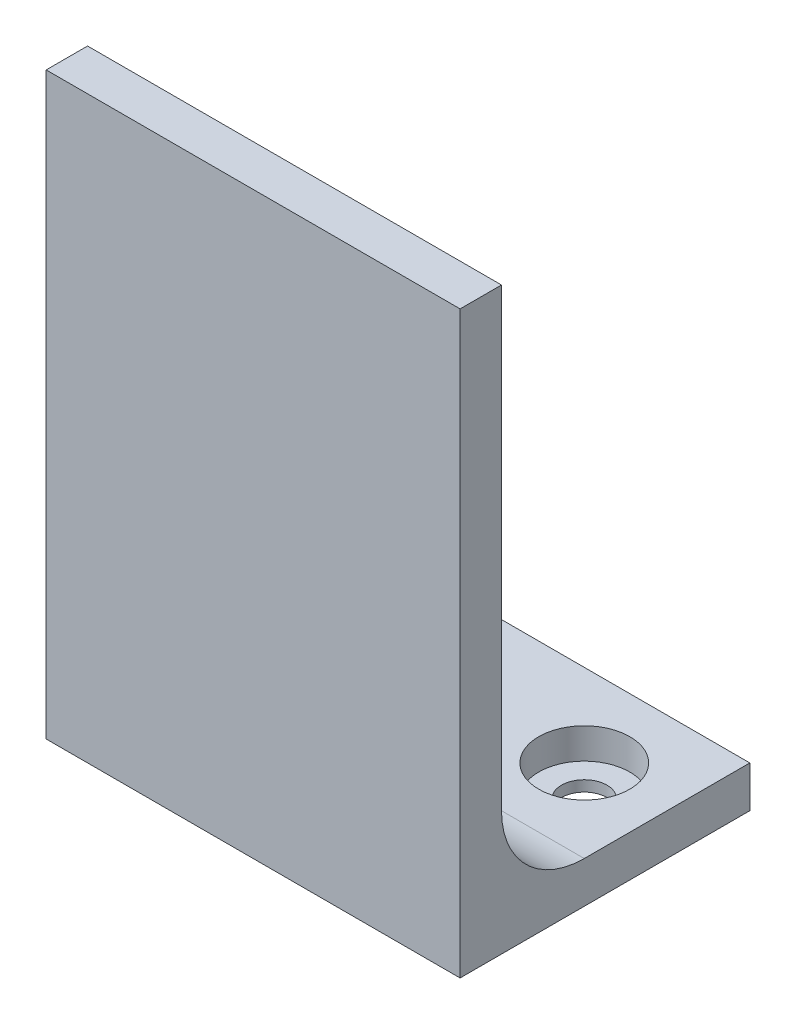
ISO-10303-21;
HEADER;
FILE_DESCRIPTION(('STEP AP214'),'2;1');
FILE_NAME('part.step','',(''),(''),'','','');
FILE_SCHEMA(('AUTOMOTIVE_DESIGN { 1 0 10303 214 1 1 1 1 }'));
ENDSEC;
DATA;
#1=APPLICATION_CONTEXT('core data for automotive mechanical design processes');
#2=APPLICATION_PROTOCOL_DEFINITION('international standard','automotive_design',2000,#1);
#3=PRODUCT_CONTEXT('',#1,'mechanical');
#4=PRODUCT('Part','Part','',(#3));
#5=PRODUCT_RELATED_PRODUCT_CATEGORY('part','',(#4));
#6=PRODUCT_DEFINITION_FORMATION('','',#4);
#7=PRODUCT_DEFINITION_CONTEXT('part definition',#1,'design');
#8=PRODUCT_DEFINITION('design','',#6,#7);
#9=PRODUCT_DEFINITION_SHAPE('','',#8);
#10=(LENGTH_UNIT() NAMED_UNIT(*) SI_UNIT(.MILLI.,.METRE.));
#11=(NAMED_UNIT(*) PLANE_ANGLE_UNIT() SI_UNIT($,.RADIAN.));
#12=(NAMED_UNIT(*) SI_UNIT($,.STERADIAN.) SOLID_ANGLE_UNIT());
#13=UNCERTAINTY_MEASURE_WITH_UNIT(LENGTH_MEASURE(1.E-05),#10,'distance_accuracy_value','');
#14=(GEOMETRIC_REPRESENTATION_CONTEXT(3) GLOBAL_UNCERTAINTY_ASSIGNED_CONTEXT((#13)) GLOBAL_UNIT_ASSIGNED_CONTEXT((#10,
#11,#12)) REPRESENTATION_CONTEXT('',''));
#15=CARTESIAN_POINT('',(0.,0.,0.));
#16=DIRECTION('',(0.,0.,1.));
#17=DIRECTION('',(1.,0.,0.));
#18=AXIS2_PLACEMENT_3D('',#15,#16,#17);
#19=CARTESIAN_POINT('',(50.,5.,-15.0000000000001));
#20=DIRECTION('',(0.,-1.,0.));
#21=DIRECTION('',(0.,0.,-1.));
#22=AXIS2_PLACEMENT_3D('',#19,#20,#21);
#23=PLANE('',#22);
#24=CARTESIAN_POINT('',(10.,5.,-25.));
#25=DIRECTION('',(0.,1.,0.));
#26=DIRECTION('',(0.,0.,1.));
#27=AXIS2_PLACEMENT_3D('',#24,#25,#26);
#28=CIRCLE('',#27,5.5);
#29=CARTESIAN_POINT('',(10.,5.,-19.5));
#30=VERTEX_POINT('',#29);
#31=EDGE_CURVE('E310',#30,#30,#28,.T.);
#32=ORIENTED_EDGE('',*,*,#31,.F.);
#33=EDGE_LOOP('',(#32));
#34=FACE_BOUND('',#33,.T.);
#35=DIRECTION('',(0.,0.,1.));
#36=VECTOR('',#35,1.);
#37=CARTESIAN_POINT('',(0.,5.,-15.0000000000001));
#38=LINE('',#37,#36);
#39=CARTESIAN_POINT('',(0.,5.,-35.));
#40=VERTEX_POINT('',#39);
#41=CARTESIAN_POINT('',(0.,5.,-15.0000000000001));
#42=VERTEX_POINT('',#41);
#43=EDGE_CURVE('E140',#40,#42,#38,.T.);
#44=ORIENTED_EDGE('',*,*,#43,.T.);
#45=DIRECTION('',(-1.,0.,0.));
#46=VECTOR('',#45,1.);
#47=CARTESIAN_POINT('',(50.,5.,-15.0000000000001));
#48=LINE('',#47,#46);
#49=CARTESIAN_POINT('',(50.,5.,-15.0000000000001));
#50=VERTEX_POINT('',#49);
#51=EDGE_CURVE('E151',#50,#42,#48,.T.);
#52=ORIENTED_EDGE('',*,*,#51,.F.);
#53=DIRECTION('',(0.,0.,1.));
#54=VECTOR('',#53,1.);
#55=CARTESIAN_POINT('',(50.,5.,-15.0000000000001));
#56=LINE('',#55,#54);
#57=CARTESIAN_POINT('',(50.,5.,-35.));
#58=VERTEX_POINT('',#57);
#59=EDGE_CURVE('E171',#58,#50,#56,.T.);
#60=ORIENTED_EDGE('',*,*,#59,.F.);
#61=DIRECTION('',(-1.,0.,0.));
#62=VECTOR('',#61,1.);
#63=CARTESIAN_POINT('',(50.,5.,-35.));
#64=LINE('',#63,#62);
#65=EDGE_CURVE('E51',#58,#40,#64,.T.);
#66=ORIENTED_EDGE('',*,*,#65,.T.);
#67=EDGE_LOOP('',(#44,#52,#60,#66));
#68=FACE_BOUND('',#67,.T.);
#69=CARTESIAN_POINT('',(40.,5.,-25.));
#70=DIRECTION('',(0.,1.,0.));
#71=DIRECTION('',(0.,0.,1.));
#72=AXIS2_PLACEMENT_3D('',#69,#70,#71);
#73=CIRCLE('',#72,5.5);
#74=CARTESIAN_POINT('',(40.,5.,-19.5));
#75=VERTEX_POINT('',#74);
#76=EDGE_CURVE('E165',#75,#75,#73,.T.);
#77=ORIENTED_EDGE('',*,*,#76,.F.);
#78=EDGE_LOOP('',(#77));
#79=FACE_BOUND('',#78,.T.);
#80=ADVANCED_FACE('F41',(#34,#68,#79),#23,.F.);
#81=CARTESIAN_POINT('',(50.,0.,-35.));
#82=DIRECTION('',(0.,1.,0.));
#83=DIRECTION('',(0.,0.,1.));
#84=AXIS2_PLACEMENT_3D('',#81,#82,#83);
#85=PLANE('',#84);
#86=CARTESIAN_POINT('',(10.,0.,-25.));
#87=DIRECTION('',(0.,1.,0.));
#88=DIRECTION('',(0.,0.,1.));
#89=AXIS2_PLACEMENT_3D('',#86,#87,#88);
#90=CIRCLE('',#89,2.74999999999999);
#91=CARTESIAN_POINT('',(10.,0.,-22.25));
#92=VERTEX_POINT('',#91);
#93=EDGE_CURVE('E45',#92,#92,#90,.T.);
#94=ORIENTED_EDGE('',*,*,#93,.T.);
#95=EDGE_LOOP('',(#94));
#96=FACE_BOUND('',#95,.T.);
#97=CARTESIAN_POINT('',(40.,0.,-25.));
#98=DIRECTION('',(0.,1.,0.));
#99=DIRECTION('',(0.,0.,1.));
#100=AXIS2_PLACEMENT_3D('',#97,#98,#99);
#101=CIRCLE('',#100,2.74999999999999);
#102=CARTESIAN_POINT('',(40.,0.,-22.25));
#103=VERTEX_POINT('',#102);
#104=EDGE_CURVE('E138',#103,#103,#101,.T.);
#105=ORIENTED_EDGE('',*,*,#104,.T.);
#106=EDGE_LOOP('',(#105));
#107=FACE_BOUND('',#106,.T.);
#108=DIRECTION('',(0.,0.,-1.));
#109=VECTOR('',#108,1.);
#110=CARTESIAN_POINT('',(0.,0.,-35.));
#111=LINE('',#110,#109);
#112=CARTESIAN_POINT('',(0.,0.,0.));
#113=VERTEX_POINT('',#112);
#114=CARTESIAN_POINT('',(0.,0.,-35.));
#115=VERTEX_POINT('',#114);
#116=EDGE_CURVE('E134',#113,#115,#111,.T.);
#117=ORIENTED_EDGE('',*,*,#116,.T.);
#118=DIRECTION('',(-1.,0.,0.));
#119=VECTOR('',#118,1.);
#120=CARTESIAN_POINT('',(50.,0.,-35.));
#121=LINE('',#120,#119);
#122=CARTESIAN_POINT('',(50.,0.,-35.));
#123=VERTEX_POINT('',#122);
#124=EDGE_CURVE('E11',#123,#115,#121,.T.);
#125=ORIENTED_EDGE('',*,*,#124,.F.);
#126=DIRECTION('',(0.,0.,-1.));
#127=VECTOR('',#126,1.);
#128=CARTESIAN_POINT('',(50.,0.,-35.));
#129=LINE('',#128,#127);
#130=CARTESIAN_POINT('',(50.,0.,0.));
#131=VERTEX_POINT('',#130);
#132=EDGE_CURVE('E147',#131,#123,#129,.T.);
#133=ORIENTED_EDGE('',*,*,#132,.F.);
#134=DIRECTION('',(-1.,0.,0.));
#135=VECTOR('',#134,1.);
#136=CARTESIAN_POINT('',(50.,0.,0.));
#137=LINE('',#136,#135);
#138=EDGE_CURVE('E130',#131,#113,#137,.T.);
#139=ORIENTED_EDGE('',*,*,#138,.T.);
#140=EDGE_LOOP('',(#117,#125,#133,#139));
#141=FACE_BOUND('',#140,.T.);
#142=ADVANCED_FACE('F43',(#96,#107,#141),#85,.F.);
#143=CARTESIAN_POINT('',(50.,5.,-35.));
#144=DIRECTION('',(0.,0.,1.));
#145=DIRECTION('',(1.,0.,0.));
#146=AXIS2_PLACEMENT_3D('',#143,#144,#145);
#147=PLANE('',#146);
#148=DIRECTION('',(0.,1.,0.));
#149=VECTOR('',#148,1.);
#150=CARTESIAN_POINT('',(0.,5.,-35.));
#151=LINE('',#150,#149);
#152=EDGE_CURVE('E137',#115,#40,#151,.T.);
#153=ORIENTED_EDGE('',*,*,#152,.T.);
#154=ORIENTED_EDGE('',*,*,#65,.F.);
#155=DIRECTION('',(0.,1.,0.));
#156=VECTOR('',#155,1.);
#157=CARTESIAN_POINT('',(50.,5.,-35.));
#158=LINE('',#157,#156);
#159=EDGE_CURVE('E100',#123,#58,#158,.T.);
#160=ORIENTED_EDGE('',*,*,#159,.F.);
#161=ORIENTED_EDGE('',*,*,#124,.T.);
#162=EDGE_LOOP('',(#153,#154,#160,#161));
#163=FACE_BOUND('',#162,.T.);
#164=ADVANCED_FACE('F203',(#163),#147,.F.);
#165=CARTESIAN_POINT('',(50.,15.,-15.));
#166=DIRECTION('',(-1.,0.,0.));
#167=DIRECTION('',(0.,0.,1.));
#168=AXIS2_PLACEMENT_3D('',#165,#166,#167);
#169=CYLINDRICAL_SURFACE('',#168,10.);
#170=CARTESIAN_POINT('',(0.,15.,-15.));
#171=DIRECTION('',(-1.,0.,0.));
#172=DIRECTION('',(0.,0.,-1.));
#173=AXIS2_PLACEMENT_3D('',#170,#171,#172);
#174=CIRCLE('',#173,10.);
#175=CARTESIAN_POINT('',(0.,15.0000000000001,-5.));
#176=VERTEX_POINT('',#175);
#177=EDGE_CURVE('E142',#42,#176,#174,.T.);
#178=ORIENTED_EDGE('',*,*,#177,.T.);
#179=DIRECTION('',(-1.,0.,0.));
#180=VECTOR('',#179,1.);
#181=CARTESIAN_POINT('',(50.,15.0000000000001,-5.));
#182=LINE('',#181,#180);
#183=CARTESIAN_POINT('',(50.,15.0000000000001,-5.));
#184=VERTEX_POINT('',#183);
#185=EDGE_CURVE('E125',#184,#176,#182,.T.);
#186=ORIENTED_EDGE('',*,*,#185,.F.);
#187=CARTESIAN_POINT('',(50.,15.,-15.));
#188=DIRECTION('',(-1.,0.,0.));
#189=DIRECTION('',(0.,0.,-1.));
#190=AXIS2_PLACEMENT_3D('',#187,#188,#189);
#191=CIRCLE('',#190,10.);
#192=EDGE_CURVE('E116',#50,#184,#191,.T.);
#193=ORIENTED_EDGE('',*,*,#192,.F.);
#194=ORIENTED_EDGE('',*,*,#51,.T.);
#195=EDGE_LOOP('',(#178,#186,#193,#194));
#196=FACE_BOUND('',#195,.T.);
#197=ADVANCED_FACE('F179',(#196),#169,.F.);
#198=CARTESIAN_POINT('',(50.,70.,-5.));
#199=DIRECTION('',(0.,0.,1.));
#200=DIRECTION('',(0.,-1.,0.));
#201=AXIS2_PLACEMENT_3D('',#198,#199,#200);
#202=PLANE('',#201);
#203=DIRECTION('',(0.,1.,0.));
#204=VECTOR('',#203,1.);
#205=CARTESIAN_POINT('',(0.,70.,-5.));
#206=LINE('',#205,#204);
#207=CARTESIAN_POINT('',(0.,70.,-5.));
#208=VERTEX_POINT('',#207);
#209=EDGE_CURVE('E124',#176,#208,#206,.T.);
#210=ORIENTED_EDGE('',*,*,#209,.T.);
#211=DIRECTION('',(-1.,0.,0.));
#212=VECTOR('',#211,1.);
#213=CARTESIAN_POINT('',(50.,70.,-5.));
#214=LINE('',#213,#212);
#215=CARTESIAN_POINT('',(50.,70.,-5.));
#216=VERTEX_POINT('',#215);
#217=EDGE_CURVE('E121',#216,#208,#214,.T.);
#218=ORIENTED_EDGE('',*,*,#217,.F.);
#219=DIRECTION('',(0.,1.,0.));
#220=VECTOR('',#219,1.);
#221=CARTESIAN_POINT('',(50.,70.,-5.));
#222=LINE('',#221,#220);
#223=EDGE_CURVE('E110',#184,#216,#222,.T.);
#224=ORIENTED_EDGE('',*,*,#223,.F.);
#225=ORIENTED_EDGE('',*,*,#185,.T.);
#226=EDGE_LOOP('',(#210,#218,#224,#225));
#227=FACE_BOUND('',#226,.T.);
#228=ADVANCED_FACE('F122',(#227),#202,.F.);
#229=CARTESIAN_POINT('',(50.,70.,0.));
#230=DIRECTION('',(0.,-1.,0.));
#231=DIRECTION('',(0.,0.,-1.));
#232=AXIS2_PLACEMENT_3D('',#229,#230,#231);
#233=PLANE('',#232);
#234=DIRECTION('',(0.,0.,1.));
#235=VECTOR('',#234,1.);
#236=CARTESIAN_POINT('',(0.,70.,0.));
#237=LINE('',#236,#235);
#238=CARTESIAN_POINT('',(0.,70.,0.));
#239=VERTEX_POINT('',#238);
#240=EDGE_CURVE('E86',#208,#239,#237,.T.);
#241=ORIENTED_EDGE('',*,*,#240,.T.);
#242=DIRECTION('',(-1.,0.,0.));
#243=VECTOR('',#242,1.);
#244=CARTESIAN_POINT('',(50.,70.,0.));
#245=LINE('',#244,#243);
#246=CARTESIAN_POINT('',(50.,70.,0.));
#247=VERTEX_POINT('',#246);
#248=EDGE_CURVE('E126',#247,#239,#245,.T.);
#249=ORIENTED_EDGE('',*,*,#248,.F.);
#250=DIRECTION('',(0.,0.,1.));
#251=VECTOR('',#250,1.);
#252=CARTESIAN_POINT('',(50.,70.,0.));
#253=LINE('',#252,#251);
#254=EDGE_CURVE('E114',#216,#247,#253,.T.);
#255=ORIENTED_EDGE('',*,*,#254,.F.);
#256=ORIENTED_EDGE('',*,*,#217,.T.);
#257=EDGE_LOOP('',(#241,#249,#255,#256));
#258=FACE_BOUND('',#257,.T.);
#259=ADVANCED_FACE('F128',(#258),#233,.F.);
#260=CARTESIAN_POINT('',(50.,0.,0.));
#261=DIRECTION('',(0.,0.,-1.));
#262=DIRECTION('',(-1.,0.,0.));
#263=AXIS2_PLACEMENT_3D('',#260,#261,#262);
#264=PLANE('',#263);
#265=DIRECTION('',(0.,-1.,0.));
#266=VECTOR('',#265,1.);
#267=CARTESIAN_POINT('',(0.,0.,0.));
#268=LINE('',#267,#266);
#269=EDGE_CURVE('E92',#239,#113,#268,.T.);
#270=ORIENTED_EDGE('',*,*,#269,.T.);
#271=ORIENTED_EDGE('',*,*,#138,.F.);
#272=DIRECTION('',(0.,-1.,0.));
#273=VECTOR('',#272,1.);
#274=CARTESIAN_POINT('',(50.,0.,0.));
#275=LINE('',#274,#273);
#276=EDGE_CURVE('E60',#247,#131,#275,.T.);
#277=ORIENTED_EDGE('',*,*,#276,.F.);
#278=ORIENTED_EDGE('',*,*,#248,.T.);
#279=EDGE_LOOP('',(#270,#271,#277,#278));
#280=FACE_BOUND('',#279,.T.);
#281=ADVANCED_FACE('F186',(#280),#264,.F.);
#282=CARTESIAN_POINT('',(50.,15.,-15.));
#283=DIRECTION('',(1.,0.,0.));
#284=DIRECTION('',(0.,0.,-1.));
#285=AXIS2_PLACEMENT_3D('',#282,#283,#284);
#286=PLANE('',#285);
#287=ORIENTED_EDGE('',*,*,#132,.T.);
#288=ORIENTED_EDGE('',*,*,#159,.T.);
#289=ORIENTED_EDGE('',*,*,#59,.T.);
#290=ORIENTED_EDGE('',*,*,#192,.T.);
#291=ORIENTED_EDGE('',*,*,#223,.T.);
#292=ORIENTED_EDGE('',*,*,#254,.T.);
#293=ORIENTED_EDGE('',*,*,#276,.T.);
#294=EDGE_LOOP('',(#287,#288,#289,#290,#291,#292,#293));
#295=FACE_BOUND('',#294,.T.);
#296=ADVANCED_FACE('F112',(#295),#286,.T.);
#297=CARTESIAN_POINT('',(0.,15.,-15.));
#298=DIRECTION('',(1.,0.,0.));
#299=DIRECTION('',(0.,0.,-1.));
#300=AXIS2_PLACEMENT_3D('',#297,#298,#299);
#301=PLANE('',#300);
#302=ORIENTED_EDGE('',*,*,#116,.F.);
#303=ORIENTED_EDGE('',*,*,#269,.F.);
#304=ORIENTED_EDGE('',*,*,#240,.F.);
#305=ORIENTED_EDGE('',*,*,#209,.F.);
#306=ORIENTED_EDGE('',*,*,#177,.F.);
#307=ORIENTED_EDGE('',*,*,#43,.F.);
#308=ORIENTED_EDGE('',*,*,#152,.F.);
#309=EDGE_LOOP('',(#302,#303,#304,#305,#306,#307,#308));
#310=FACE_BOUND('',#309,.T.);
#311=ADVANCED_FACE('F182',(#310),#301,.F.);
#312=CARTESIAN_POINT('',(40.,5.,-25.));
#313=DIRECTION('',(0.,1.,0.));
#314=DIRECTION('',(0.,0.,1.));
#315=AXIS2_PLACEMENT_3D('',#312,#313,#314);
#316=CYLINDRICAL_SURFACE('',#315,2.74999999999999);
#317=CARTESIAN_POINT('',(40.,1.3,-25.));
#318=DIRECTION('',(0.,1.,0.));
#319=DIRECTION('',(0.,0.,1.));
#320=AXIS2_PLACEMENT_3D('',#317,#318,#319);
#321=CIRCLE('',#320,2.75);
#322=CARTESIAN_POINT('',(40.,1.3,-22.25));
#323=VERTEX_POINT('',#322);
#324=EDGE_CURVE('E156',#323,#323,#321,.T.);
#325=ORIENTED_EDGE('',*,*,#324,.T.);
#326=EDGE_LOOP('',(#325));
#327=FACE_BOUND('',#326,.T.);
#328=ORIENTED_EDGE('',*,*,#104,.F.);
#329=EDGE_LOOP('',(#328));
#330=FACE_BOUND('',#329,.T.);
#331=ADVANCED_FACE('F241',(#327,#330),#316,.F.);
#332=CARTESIAN_POINT('',(42.75,1.3,-25.));
#333=DIRECTION('',(0.,-1.,0.));
#334=DIRECTION('',(0.,0.,-1.));
#335=AXIS2_PLACEMENT_3D('',#332,#333,#334);
#336=PLANE('',#335);
#337=ORIENTED_EDGE('',*,*,#324,.F.);
#338=EDGE_LOOP('',(#337));
#339=FACE_BOUND('',#338,.T.);
#340=CARTESIAN_POINT('',(40.,1.3,-25.));
#341=DIRECTION('',(0.,1.,0.));
#342=DIRECTION('',(0.,0.,1.));
#343=AXIS2_PLACEMENT_3D('',#340,#341,#342);
#344=CIRCLE('',#343,5.5);
#345=CARTESIAN_POINT('',(40.,1.3,-19.5));
#346=VERTEX_POINT('',#345);
#347=EDGE_CURVE('E160',#346,#346,#344,.T.);
#348=ORIENTED_EDGE('',*,*,#347,.T.);
#349=EDGE_LOOP('',(#348));
#350=FACE_BOUND('',#349,.T.);
#351=ADVANCED_FACE('F253',(#339,#350),#336,.F.);
#352=CARTESIAN_POINT('',(40.,5.,-25.));
#353=DIRECTION('',(0.,1.,0.));
#354=DIRECTION('',(0.,0.,1.));
#355=AXIS2_PLACEMENT_3D('',#352,#353,#354);
#356=CYLINDRICAL_SURFACE('',#355,5.5);
#357=ORIENTED_EDGE('',*,*,#347,.F.);
#358=EDGE_LOOP('',(#357));
#359=FACE_BOUND('',#358,.T.);
#360=ORIENTED_EDGE('',*,*,#76,.T.);
#361=EDGE_LOOP('',(#360));
#362=FACE_BOUND('',#361,.T.);
#363=ADVANCED_FACE('F262',(#359,#362),#356,.F.);
#364=CARTESIAN_POINT('',(10.,5.,-25.));
#365=DIRECTION('',(0.,1.,0.));
#366=DIRECTION('',(0.,0.,1.));
#367=AXIS2_PLACEMENT_3D('',#364,#365,#366);
#368=CYLINDRICAL_SURFACE('',#367,2.74999999999999);
#369=CARTESIAN_POINT('',(10.,1.3,-25.));
#370=DIRECTION('',(0.,1.,0.));
#371=DIRECTION('',(0.,0.,1.));
#372=AXIS2_PLACEMENT_3D('',#369,#370,#371);
#373=CIRCLE('',#372,2.75);
#374=CARTESIAN_POINT('',(10.,1.3,-22.25));
#375=VERTEX_POINT('',#374);
#376=EDGE_CURVE('E312',#375,#375,#373,.T.);
#377=ORIENTED_EDGE('',*,*,#376,.T.);
#378=EDGE_LOOP('',(#377));
#379=FACE_BOUND('',#378,.T.);
#380=ORIENTED_EDGE('',*,*,#93,.F.);
#381=EDGE_LOOP('',(#380));
#382=FACE_BOUND('',#381,.T.);
#383=ADVANCED_FACE('F272',(#379,#382),#368,.F.);
#384=CARTESIAN_POINT('',(12.75,1.3,-25.));
#385=DIRECTION('',(0.,-1.,0.));
#386=DIRECTION('',(0.,0.,-1.));
#387=AXIS2_PLACEMENT_3D('',#384,#385,#386);
#388=PLANE('',#387);
#389=ORIENTED_EDGE('',*,*,#376,.F.);
#390=EDGE_LOOP('',(#389));
#391=FACE_BOUND('',#390,.T.);
#392=CARTESIAN_POINT('',(10.,1.3,-25.));
#393=DIRECTION('',(0.,1.,0.));
#394=DIRECTION('',(0.,0.,1.));
#395=AXIS2_PLACEMENT_3D('',#392,#393,#394);
#396=CIRCLE('',#395,5.5);
#397=CARTESIAN_POINT('',(10.,1.3,-19.5));
#398=VERTEX_POINT('',#397);
#399=EDGE_CURVE('E308',#398,#398,#396,.T.);
#400=ORIENTED_EDGE('',*,*,#399,.T.);
#401=EDGE_LOOP('',(#400));
#402=FACE_BOUND('',#401,.T.);
#403=ADVANCED_FACE('F282',(#391,#402),#388,.F.);
#404=CARTESIAN_POINT('',(10.,5.,-25.));
#405=DIRECTION('',(0.,1.,0.));
#406=DIRECTION('',(0.,0.,1.));
#407=AXIS2_PLACEMENT_3D('',#404,#405,#406);
#408=CYLINDRICAL_SURFACE('',#407,5.5);
#409=ORIENTED_EDGE('',*,*,#399,.F.);
#410=EDGE_LOOP('',(#409));
#411=FACE_BOUND('',#410,.T.);
#412=ORIENTED_EDGE('',*,*,#31,.T.);
#413=EDGE_LOOP('',(#412));
#414=FACE_BOUND('',#413,.T.);
#415=ADVANCED_FACE('F292',(#411,#414),#408,.F.);
#416=CLOSED_SHELL('',(#80,#142,#164,#197,#228,#259,#281,#296,#311,#331,#351,#363,#383,#403,#415));
#417=MANIFOLD_SOLID_BREP('B2',#416);
#418=ADVANCED_BREP_SHAPE_REPRESENTATION('',(#18,#417),#14);
#419=SHAPE_DEFINITION_REPRESENTATION(#9,#418);
ENDSEC;
END-ISO-10303-21;
